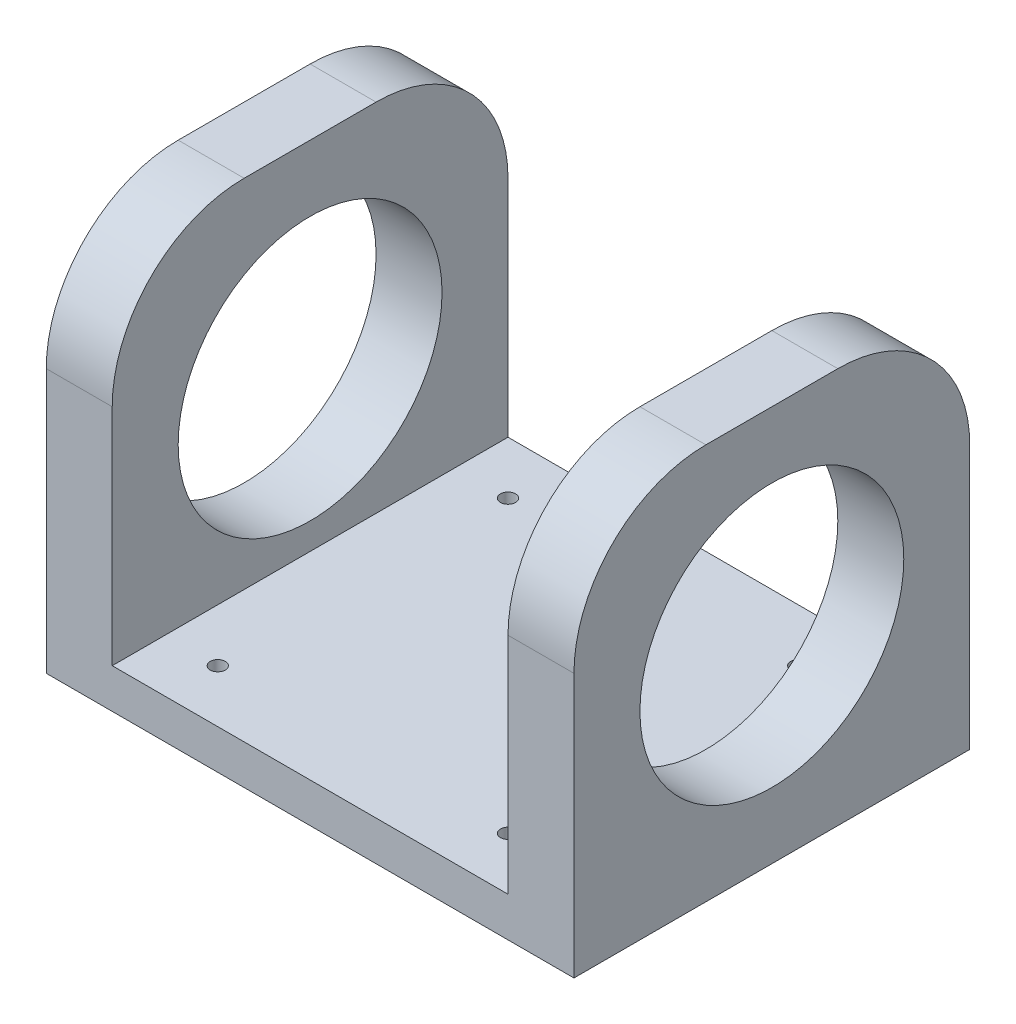
ISO-10303-21;
HEADER;
FILE_DESCRIPTION(('STEP AP214'),'2;1');
FILE_NAME('part.step','',(''),(''),'','','');
FILE_SCHEMA(('AUTOMOTIVE_DESIGN { 1 0 10303 214 1 1 1 1 }'));
ENDSEC;
DATA;
#1=APPLICATION_CONTEXT('core data for automotive mechanical design processes');
#2=APPLICATION_PROTOCOL_DEFINITION('international standard','automotive_design',2000,#1);
#3=PRODUCT_CONTEXT('',#1,'mechanical');
#4=PRODUCT('Part','Part','',(#3));
#5=PRODUCT_RELATED_PRODUCT_CATEGORY('part','',(#4));
#6=PRODUCT_DEFINITION_FORMATION('','',#4);
#7=PRODUCT_DEFINITION_CONTEXT('part definition',#1,'design');
#8=PRODUCT_DEFINITION('design','',#6,#7);
#9=PRODUCT_DEFINITION_SHAPE('','',#8);
#10=(LENGTH_UNIT() NAMED_UNIT(*) SI_UNIT(.MILLI.,.METRE.));
#11=(NAMED_UNIT(*) PLANE_ANGLE_UNIT() SI_UNIT($,.RADIAN.));
#12=(NAMED_UNIT(*) SI_UNIT($,.STERADIAN.) SOLID_ANGLE_UNIT());
#13=UNCERTAINTY_MEASURE_WITH_UNIT(LENGTH_MEASURE(1.E-05),#10,'distance_accuracy_value','');
#14=(GEOMETRIC_REPRESENTATION_CONTEXT(3) GLOBAL_UNCERTAINTY_ASSIGNED_CONTEXT((#13)) GLOBAL_UNIT_ASSIGNED_CONTEXT((#10,
#11,#12)) REPRESENTATION_CONTEXT('',''));
#15=CARTESIAN_POINT('',(0.,0.,0.));
#16=DIRECTION('',(0.,0.,1.));
#17=DIRECTION('',(1.,0.,0.));
#18=AXIS2_PLACEMENT_3D('',#15,#16,#17);
#19=CARTESIAN_POINT('',(-50.8,-30.48,-38.1));
#20=DIRECTION('',(-1.,0.,0.));
#21=DIRECTION('',(0.,0.,1.));
#22=AXIS2_PLACEMENT_3D('',#19,#20,#21);
#23=PLANE('',#22);
#24=CARTESIAN_POINT('',(-50.8,7.62000000000001,0.));
#25=DIRECTION('',(-1.,0.,0.));
#26=DIRECTION('',(0.,0.,1.));
#27=AXIS2_PLACEMENT_3D('',#24,#25,#26);
#28=CIRCLE('',#27,25.4);
#29=CARTESIAN_POINT('',(-50.8,7.62000000000001,25.4));
#30=VERTEX_POINT('',#29);
#31=EDGE_CURVE('E183',#30,#30,#28,.T.);
#32=ORIENTED_EDGE('',*,*,#31,.F.);
#33=EDGE_LOOP('',(#32));
#34=FACE_BOUND('',#33,.T.);
#35=CARTESIAN_POINT('',(-50.8,20.32,-12.7));
#36=DIRECTION('',(-1.,0.,0.));
#37=DIRECTION('',(0.,0.,-1.));
#38=AXIS2_PLACEMENT_3D('',#35,#36,#37);
#39=CIRCLE('',#38,25.4);
#40=CARTESIAN_POINT('',(-50.8,45.72,-12.7));
#41=VERTEX_POINT('',#40);
#42=CARTESIAN_POINT('',(-50.8,20.32,-38.1));
#43=VERTEX_POINT('',#42);
#44=EDGE_CURVE('E197',#41,#43,#39,.T.);
#45=ORIENTED_EDGE('',*,*,#44,.T.);
#46=DIRECTION('',(0.,1.,0.));
#47=VECTOR('',#46,1.);
#48=CARTESIAN_POINT('',(-50.8,-30.48,-38.1));
#49=LINE('',#48,#47);
#50=CARTESIAN_POINT('',(-50.8,-30.48,-38.1));
#51=VERTEX_POINT('',#50);
#52=EDGE_CURVE('E11',#51,#43,#49,.T.);
#53=ORIENTED_EDGE('',*,*,#52,.F.);
#54=DIRECTION('',(0.,0.,1.));
#55=VECTOR('',#54,1.);
#56=CARTESIAN_POINT('',(-50.8,-30.48,-38.1));
#57=LINE('',#56,#55);
#58=CARTESIAN_POINT('',(-50.8,-30.48,38.1));
#59=VERTEX_POINT('',#58);
#60=EDGE_CURVE('E217',#51,#59,#57,.T.);
#61=ORIENTED_EDGE('',*,*,#60,.T.);
#62=DIRECTION('',(0.,1.,0.));
#63=VECTOR('',#62,1.);
#64=CARTESIAN_POINT('',(-50.8,-30.48,38.1));
#65=LINE('',#64,#63);
#66=CARTESIAN_POINT('',(-50.8,20.32,38.1));
#67=VERTEX_POINT('',#66);
#68=EDGE_CURVE('E39',#59,#67,#65,.T.);
#69=ORIENTED_EDGE('',*,*,#68,.T.);
#70=CARTESIAN_POINT('',(-50.8,20.32,12.7));
#71=DIRECTION('',(-1.,0.,0.));
#72=DIRECTION('',(0.,0.,-1.));
#73=AXIS2_PLACEMENT_3D('',#70,#71,#72);
#74=CIRCLE('',#73,25.4);
#75=CARTESIAN_POINT('',(-50.8,45.72,12.7));
#76=VERTEX_POINT('',#75);
#77=EDGE_CURVE('E194',#67,#76,#74,.T.);
#78=ORIENTED_EDGE('',*,*,#77,.T.);
#79=DIRECTION('',(0.,0.,-1.));
#80=VECTOR('',#79,1.);
#81=CARTESIAN_POINT('',(-50.8,45.72,-12.7));
#82=LINE('',#81,#80);
#83=EDGE_CURVE('E209',#76,#41,#82,.T.);
#84=ORIENTED_EDGE('',*,*,#83,.T.);
#85=EDGE_LOOP('',(#45,#53,#61,#69,#78,#84));
#86=FACE_BOUND('',#85,.T.);
#87=ADVANCED_FACE('F36',(#34,#86),#23,.T.);
#88=CARTESIAN_POINT('',(50.8,-30.48,-38.1));
#89=DIRECTION('',(0.,0.,-1.));
#90=DIRECTION('',(-1.,0.,0.));
#91=AXIS2_PLACEMENT_3D('',#88,#89,#90);
#92=PLANE('',#91);
#93=DIRECTION('',(0.,-1.,0.));
#94=VECTOR('',#93,1.);
#95=CARTESIAN_POINT('',(-38.1,-30.48,-38.1));
#96=LINE('',#95,#94);
#97=CARTESIAN_POINT('',(-38.1,20.32,-38.1));
#98=VERTEX_POINT('',#97);
#99=CARTESIAN_POINT('',(-38.1,-22.86,-38.1));
#100=VERTEX_POINT('',#99);
#101=EDGE_CURVE('E136',#98,#100,#96,.T.);
#102=ORIENTED_EDGE('',*,*,#101,.T.);
#103=DIRECTION('',(-1.,0.,0.));
#104=VECTOR('',#103,1.);
#105=CARTESIAN_POINT('',(-38.1,-22.86,-38.1));
#106=LINE('',#105,#104);
#107=CARTESIAN_POINT('',(38.1,-22.86,-38.1));
#108=VERTEX_POINT('',#107);
#109=EDGE_CURVE('E144',#108,#100,#106,.T.);
#110=ORIENTED_EDGE('',*,*,#109,.F.);
#111=DIRECTION('',(0.,-1.,0.));
#112=VECTOR('',#111,1.);
#113=CARTESIAN_POINT('',(38.1,-30.48,-38.1));
#114=LINE('',#113,#112);
#115=CARTESIAN_POINT('',(38.1,20.32,-38.1));
#116=VERTEX_POINT('',#115);
#117=EDGE_CURVE('E164',#116,#108,#114,.T.);
#118=ORIENTED_EDGE('',*,*,#117,.F.);
#119=DIRECTION('',(1.,0.,0.));
#120=VECTOR('',#119,1.);
#121=CARTESIAN_POINT('',(38.1,20.32,-38.1));
#122=LINE('',#121,#120);
#123=CARTESIAN_POINT('',(50.8,20.32,-38.1));
#124=VERTEX_POINT('',#123);
#125=EDGE_CURVE('E174',#116,#124,#122,.T.);
#126=ORIENTED_EDGE('',*,*,#125,.T.);
#127=DIRECTION('',(0.,1.,0.));
#128=VECTOR('',#127,1.);
#129=CARTESIAN_POINT('',(50.8,-30.48,-38.1));
#130=LINE('',#129,#128);
#131=CARTESIAN_POINT('',(50.8,-30.48,-38.1));
#132=VERTEX_POINT('',#131);
#133=EDGE_CURVE('E44',#132,#124,#130,.T.);
#134=ORIENTED_EDGE('',*,*,#133,.F.);
#135=DIRECTION('',(-1.,0.,0.));
#136=VECTOR('',#135,1.);
#137=CARTESIAN_POINT('',(50.8,-30.48,-38.1));
#138=LINE('',#137,#136);
#139=EDGE_CURVE('E51',#132,#51,#138,.T.);
#140=ORIENTED_EDGE('',*,*,#139,.T.);
#141=ORIENTED_EDGE('',*,*,#52,.T.);
#142=DIRECTION('',(-1.,0.,0.));
#143=VECTOR('',#142,1.);
#144=CARTESIAN_POINT('',(-38.1,20.32,-38.1));
#145=LINE('',#144,#143);
#146=EDGE_CURVE('E214',#98,#43,#145,.T.);
#147=ORIENTED_EDGE('',*,*,#146,.F.);
#148=EDGE_LOOP('',(#102,#110,#118,#126,#134,#140,#141,#147));
#149=FACE_BOUND('',#148,.T.);
#150=ADVANCED_FACE('F245',(#149),#92,.T.);
#151=CARTESIAN_POINT('',(50.8,-30.48,-38.1));
#152=DIRECTION('',(1.,0.,0.));
#153=DIRECTION('',(0.,0.,-1.));
#154=AXIS2_PLACEMENT_3D('',#151,#152,#153);
#155=PLANE('',#154);
#156=CARTESIAN_POINT('',(50.8,7.62000000000001,0.));
#157=DIRECTION('',(-1.,0.,0.));
#158=DIRECTION('',(0.,0.,1.));
#159=AXIS2_PLACEMENT_3D('',#156,#157,#158);
#160=CIRCLE('',#159,25.4);
#161=CARTESIAN_POINT('',(50.8,7.62000000000001,25.4));
#162=VERTEX_POINT('',#161);
#163=EDGE_CURVE('E157',#162,#162,#160,.T.);
#164=ORIENTED_EDGE('',*,*,#163,.T.);
#165=EDGE_LOOP('',(#164));
#166=FACE_BOUND('',#165,.T.);
#167=ORIENTED_EDGE('',*,*,#133,.T.);
#168=CARTESIAN_POINT('',(50.8,20.32,-12.7));
#169=DIRECTION('',(-1.,0.,0.));
#170=DIRECTION('',(0.,0.,-1.));
#171=AXIS2_PLACEMENT_3D('',#168,#169,#170);
#172=CIRCLE('',#171,25.4);
#173=CARTESIAN_POINT('',(50.8,45.72,-12.7));
#174=VERTEX_POINT('',#173);
#175=EDGE_CURVE('E161',#174,#124,#172,.T.);
#176=ORIENTED_EDGE('',*,*,#175,.F.);
#177=DIRECTION('',(0.,0.,-1.));
#178=VECTOR('',#177,1.);
#179=CARTESIAN_POINT('',(50.8,45.72,-12.7));
#180=LINE('',#179,#178);
#181=CARTESIAN_POINT('',(50.8,45.72,12.7));
#182=VERTEX_POINT('',#181);
#183=EDGE_CURVE('E177',#182,#174,#180,.T.);
#184=ORIENTED_EDGE('',*,*,#183,.F.);
#185=CARTESIAN_POINT('',(50.8,20.32,12.7));
#186=DIRECTION('',(-1.,0.,0.));
#187=DIRECTION('',(0.,0.,-1.));
#188=AXIS2_PLACEMENT_3D('',#185,#186,#187);
#189=CIRCLE('',#188,25.4);
#190=CARTESIAN_POINT('',(50.8,20.32,38.1));
#191=VERTEX_POINT('',#190);
#192=EDGE_CURVE('E167',#191,#182,#189,.T.);
#193=ORIENTED_EDGE('',*,*,#192,.F.);
#194=DIRECTION('',(0.,1.,0.));
#195=VECTOR('',#194,1.);
#196=CARTESIAN_POINT('',(50.8,-30.48,38.1));
#197=LINE('',#196,#195);
#198=CARTESIAN_POINT('',(50.8,-30.48,38.1));
#199=VERTEX_POINT('',#198);
#200=EDGE_CURVE('E230',#199,#191,#197,.T.);
#201=ORIENTED_EDGE('',*,*,#200,.F.);
#202=DIRECTION('',(0.,0.,-1.));
#203=VECTOR('',#202,1.);
#204=CARTESIAN_POINT('',(50.8,-30.48,-38.1));
#205=LINE('',#204,#203);
#206=EDGE_CURVE('E227',#199,#132,#205,.T.);
#207=ORIENTED_EDGE('',*,*,#206,.T.);
#208=EDGE_LOOP('',(#167,#176,#184,#193,#201,#207));
#209=FACE_BOUND('',#208,.T.);
#210=ADVANCED_FACE('F251',(#166,#209),#155,.T.);
#211=CARTESIAN_POINT('',(50.8,-30.48,38.1));
#212=DIRECTION('',(0.,0.,1.));
#213=DIRECTION('',(1.,0.,0.));
#214=AXIS2_PLACEMENT_3D('',#211,#212,#213);
#215=PLANE('',#214);
#216=DIRECTION('',(1.,0.,0.));
#217=VECTOR('',#216,1.);
#218=CARTESIAN_POINT('',(-38.1,-22.86,38.1));
#219=LINE('',#218,#217);
#220=CARTESIAN_POINT('',(-38.1,-22.86,38.1));
#221=VERTEX_POINT('',#220);
#222=CARTESIAN_POINT('',(38.1,-22.86,38.1));
#223=VERTEX_POINT('',#222);
#224=EDGE_CURVE('E142',#221,#223,#219,.T.);
#225=ORIENTED_EDGE('',*,*,#224,.F.);
#226=DIRECTION('',(0.,1.,0.));
#227=VECTOR('',#226,1.);
#228=CARTESIAN_POINT('',(-38.1,-30.48,38.1));
#229=LINE('',#228,#227);
#230=CARTESIAN_POINT('',(-38.1,20.32,38.1));
#231=VERTEX_POINT('',#230);
#232=EDGE_CURVE('E123',#221,#231,#229,.T.);
#233=ORIENTED_EDGE('',*,*,#232,.T.);
#234=DIRECTION('',(-1.,0.,0.));
#235=VECTOR('',#234,1.);
#236=CARTESIAN_POINT('',(-38.1,20.32,38.1));
#237=LINE('',#236,#235);
#238=EDGE_CURVE('E206',#231,#67,#237,.T.);
#239=ORIENTED_EDGE('',*,*,#238,.T.);
#240=ORIENTED_EDGE('',*,*,#68,.F.);
#241=DIRECTION('',(1.,0.,0.));
#242=VECTOR('',#241,1.);
#243=CARTESIAN_POINT('',(50.8,-30.48,38.1));
#244=LINE('',#243,#242);
#245=EDGE_CURVE('E225',#59,#199,#244,.T.);
#246=ORIENTED_EDGE('',*,*,#245,.T.);
#247=ORIENTED_EDGE('',*,*,#200,.T.);
#248=DIRECTION('',(1.,0.,0.));
#249=VECTOR('',#248,1.);
#250=CARTESIAN_POINT('',(38.1,20.32,38.1));
#251=LINE('',#250,#249);
#252=CARTESIAN_POINT('',(38.1,20.32,38.1));
#253=VERTEX_POINT('',#252);
#254=EDGE_CURVE('E180',#253,#191,#251,.T.);
#255=ORIENTED_EDGE('',*,*,#254,.F.);
#256=DIRECTION('',(0.,1.,0.));
#257=VECTOR('',#256,1.);
#258=CARTESIAN_POINT('',(38.1,-30.48,38.1));
#259=LINE('',#258,#257);
#260=EDGE_CURVE('E149',#223,#253,#259,.T.);
#261=ORIENTED_EDGE('',*,*,#260,.F.);
#262=EDGE_LOOP('',(#225,#233,#239,#240,#246,#247,#255,#261));
#263=FACE_BOUND('',#262,.T.);
#264=ADVANCED_FACE('F147',(#263),#215,.T.);
#265=CARTESIAN_POINT('',(0.,-30.48,0.));
#266=DIRECTION('',(0.,-1.,0.));
#267=DIRECTION('',(0.,0.,-1.));
#268=AXIS2_PLACEMENT_3D('',#265,#266,#267);
#269=PLANE('',#268);
#270=CARTESIAN_POINT('',(-27.94,-30.48,27.94));
#271=DIRECTION('',(0.,-1.,0.));
#272=DIRECTION('',(0.,0.,-1.));
#273=AXIS2_PLACEMENT_3D('',#270,#271,#272);
#274=CIRCLE('',#273,1.45);
#275=CARTESIAN_POINT('',(-27.94,-30.48,26.49));
#276=VERTEX_POINT('',#275);
#277=EDGE_CURVE('E145',#276,#276,#274,.T.);
#278=ORIENTED_EDGE('',*,*,#277,.F.);
#279=EDGE_LOOP('',(#278));
#280=FACE_BOUND('',#279,.T.);
#281=CARTESIAN_POINT('',(27.94,-30.48,27.94));
#282=DIRECTION('',(0.,-1.,0.));
#283=DIRECTION('',(0.,0.,-1.));
#284=AXIS2_PLACEMENT_3D('',#281,#282,#283);
#285=CIRCLE('',#284,1.45);
#286=CARTESIAN_POINT('',(27.94,-30.48,26.49));
#287=VERTEX_POINT('',#286);
#288=EDGE_CURVE('E503',#287,#287,#285,.T.);
#289=ORIENTED_EDGE('',*,*,#288,.F.);
#290=EDGE_LOOP('',(#289));
#291=FACE_BOUND('',#290,.T.);
#292=CARTESIAN_POINT('',(27.94,-30.48,-27.94));
#293=DIRECTION('',(0.,-1.,0.));
#294=DIRECTION('',(0.,0.,-1.));
#295=AXIS2_PLACEMENT_3D('',#292,#293,#294);
#296=CIRCLE('',#295,1.45);
#297=CARTESIAN_POINT('',(27.94,-30.48,-29.39));
#298=VERTEX_POINT('',#297);
#299=EDGE_CURVE('E500',#298,#298,#296,.T.);
#300=ORIENTED_EDGE('',*,*,#299,.F.);
#301=EDGE_LOOP('',(#300));
#302=FACE_BOUND('',#301,.T.);
#303=CARTESIAN_POINT('',(-27.94,-30.48,-27.94));
#304=DIRECTION('',(0.,-1.,0.));
#305=DIRECTION('',(0.,0.,-1.));
#306=AXIS2_PLACEMENT_3D('',#303,#304,#305);
#307=CIRCLE('',#306,1.45);
#308=CARTESIAN_POINT('',(-27.94,-30.48,-29.39));
#309=VERTEX_POINT('',#308);
#310=EDGE_CURVE('E497',#309,#309,#307,.T.);
#311=ORIENTED_EDGE('',*,*,#310,.F.);
#312=EDGE_LOOP('',(#311));
#313=FACE_BOUND('',#312,.T.);
#314=ORIENTED_EDGE('',*,*,#60,.F.);
#315=ORIENTED_EDGE('',*,*,#139,.F.);
#316=ORIENTED_EDGE('',*,*,#206,.F.);
#317=ORIENTED_EDGE('',*,*,#245,.F.);
#318=EDGE_LOOP('',(#314,#315,#316,#317));
#319=FACE_BOUND('',#318,.T.);
#320=ADVANCED_FACE('F247',(#280,#291,#302,#313,#319),#269,.T.);
#321=CARTESIAN_POINT('',(-38.1,20.32,-12.7));
#322=DIRECTION('',(1.,0.,0.));
#323=DIRECTION('',(0.,0.,-1.));
#324=AXIS2_PLACEMENT_3D('',#321,#322,#323);
#325=PLANE('',#324);
#326=CARTESIAN_POINT('',(-38.1,7.62000000000001,0.));
#327=DIRECTION('',(-1.,0.,0.));
#328=DIRECTION('',(0.,0.,1.));
#329=AXIS2_PLACEMENT_3D('',#326,#327,#328);
#330=CIRCLE('',#329,25.4);
#331=CARTESIAN_POINT('',(-38.1,7.62000000000001,25.4));
#332=VERTEX_POINT('',#331);
#333=EDGE_CURVE('E191',#332,#332,#330,.T.);
#334=ORIENTED_EDGE('',*,*,#333,.T.);
#335=EDGE_LOOP('',(#334));
#336=FACE_BOUND('',#335,.T.);
#337=DIRECTION('',(0.,0.,1.));
#338=VECTOR('',#337,1.);
#339=CARTESIAN_POINT('',(-38.1,-22.86,-38.1));
#340=LINE('',#339,#338);
#341=EDGE_CURVE('E127',#100,#221,#340,.T.);
#342=ORIENTED_EDGE('',*,*,#341,.F.);
#343=ORIENTED_EDGE('',*,*,#101,.F.);
#344=CARTESIAN_POINT('',(-38.1,20.32,-12.7));
#345=DIRECTION('',(-1.,0.,0.));
#346=DIRECTION('',(0.,0.,-1.));
#347=AXIS2_PLACEMENT_3D('',#344,#345,#346);
#348=CIRCLE('',#347,25.4);
#349=CARTESIAN_POINT('',(-38.1,45.72,-12.7));
#350=VERTEX_POINT('',#349);
#351=EDGE_CURVE('E203',#350,#98,#348,.T.);
#352=ORIENTED_EDGE('',*,*,#351,.F.);
#353=DIRECTION('',(0.,0.,-1.));
#354=VECTOR('',#353,1.);
#355=CARTESIAN_POINT('',(-38.1,45.72,-12.7));
#356=LINE('',#355,#354);
#357=CARTESIAN_POINT('',(-38.1,45.72,12.7));
#358=VERTEX_POINT('',#357);
#359=EDGE_CURVE('E200',#358,#350,#356,.T.);
#360=ORIENTED_EDGE('',*,*,#359,.F.);
#361=CARTESIAN_POINT('',(-38.1,20.32,12.7));
#362=DIRECTION('',(-1.,0.,0.));
#363=DIRECTION('',(0.,0.,-1.));
#364=AXIS2_PLACEMENT_3D('',#361,#362,#363);
#365=CIRCLE('',#364,25.4);
#366=EDGE_CURVE('E131',#231,#358,#365,.T.);
#367=ORIENTED_EDGE('',*,*,#366,.F.);
#368=ORIENTED_EDGE('',*,*,#232,.F.);
#369=EDGE_LOOP('',(#342,#343,#352,#360,#367,#368));
#370=FACE_BOUND('',#369,.T.);
#371=ADVANCED_FACE('F125',(#336,#370),#325,.T.);
#372=CARTESIAN_POINT('',(-38.1,7.62000000000001,0.));
#373=DIRECTION('',(-1.,0.,0.));
#374=DIRECTION('',(0.,0.,1.));
#375=AXIS2_PLACEMENT_3D('',#372,#373,#374);
#376=CYLINDRICAL_SURFACE('',#375,25.4);
#377=ORIENTED_EDGE('',*,*,#31,.T.);
#378=EDGE_LOOP('',(#377));
#379=FACE_BOUND('',#378,.T.);
#380=ORIENTED_EDGE('',*,*,#333,.F.);
#381=EDGE_LOOP('',(#380));
#382=FACE_BOUND('',#381,.T.);
#383=ADVANCED_FACE('F288',(#379,#382),#376,.F.);
#384=CARTESIAN_POINT('',(-38.1,20.32,-12.7));
#385=DIRECTION('',(-1.,0.,0.));
#386=DIRECTION('',(0.,0.,1.));
#387=AXIS2_PLACEMENT_3D('',#384,#385,#386);
#388=CYLINDRICAL_SURFACE('',#387,25.4);
#389=ORIENTED_EDGE('',*,*,#44,.F.);
#390=DIRECTION('',(-1.,0.,0.));
#391=VECTOR('',#390,1.);
#392=CARTESIAN_POINT('',(-38.1,45.72,-12.7));
#393=LINE('',#392,#391);
#394=EDGE_CURVE('E218',#350,#41,#393,.T.);
#395=ORIENTED_EDGE('',*,*,#394,.F.);
#396=ORIENTED_EDGE('',*,*,#351,.T.);
#397=ORIENTED_EDGE('',*,*,#146,.T.);
#398=EDGE_LOOP('',(#389,#395,#396,#397));
#399=FACE_BOUND('',#398,.T.);
#400=ADVANCED_FACE('F243',(#399),#388,.T.);
#401=CARTESIAN_POINT('',(-38.1,45.72,-12.7));
#402=DIRECTION('',(0.,1.,0.));
#403=DIRECTION('',(0.,0.,1.));
#404=AXIS2_PLACEMENT_3D('',#401,#402,#403);
#405=PLANE('',#404);
#406=ORIENTED_EDGE('',*,*,#83,.F.);
#407=DIRECTION('',(-1.,0.,0.));
#408=VECTOR('',#407,1.);
#409=CARTESIAN_POINT('',(-38.1,45.72,12.7));
#410=LINE('',#409,#408);
#411=EDGE_CURVE('E220',#358,#76,#410,.T.);
#412=ORIENTED_EDGE('',*,*,#411,.F.);
#413=ORIENTED_EDGE('',*,*,#359,.T.);
#414=ORIENTED_EDGE('',*,*,#394,.T.);
#415=EDGE_LOOP('',(#406,#412,#413,#414));
#416=FACE_BOUND('',#415,.T.);
#417=ADVANCED_FACE('F240',(#416),#405,.T.);
#418=CARTESIAN_POINT('',(-38.1,20.32,12.7));
#419=DIRECTION('',(-1.,0.,0.));
#420=DIRECTION('',(0.,0.,1.));
#421=AXIS2_PLACEMENT_3D('',#418,#419,#420);
#422=CYLINDRICAL_SURFACE('',#421,25.4);
#423=ORIENTED_EDGE('',*,*,#77,.F.);
#424=ORIENTED_EDGE('',*,*,#238,.F.);
#425=ORIENTED_EDGE('',*,*,#366,.T.);
#426=ORIENTED_EDGE('',*,*,#411,.T.);
#427=EDGE_LOOP('',(#423,#424,#425,#426));
#428=FACE_BOUND('',#427,.T.);
#429=ADVANCED_FACE('F237',(#428),#422,.T.);
#430=CARTESIAN_POINT('',(38.1,20.32,-12.7));
#431=DIRECTION('',(-1.,0.,0.));
#432=DIRECTION('',(0.,0.,-1.));
#433=AXIS2_PLACEMENT_3D('',#430,#431,#432);
#434=PLANE('',#433);
#435=CARTESIAN_POINT('',(38.1,7.62000000000001,0.));
#436=DIRECTION('',(-1.,0.,0.));
#437=DIRECTION('',(0.,0.,1.));
#438=AXIS2_PLACEMENT_3D('',#435,#436,#437);
#439=CIRCLE('',#438,25.4);
#440=CARTESIAN_POINT('',(38.1,7.62000000000001,25.4));
#441=VERTEX_POINT('',#440);
#442=EDGE_CURVE('E158',#441,#441,#439,.T.);
#443=ORIENTED_EDGE('',*,*,#442,.F.);
#444=EDGE_LOOP('',(#443));
#445=FACE_BOUND('',#444,.T.);
#446=DIRECTION('',(0.,0.,-1.));
#447=VECTOR('',#446,1.);
#448=CARTESIAN_POINT('',(38.1,-22.86,-38.1));
#449=LINE('',#448,#447);
#450=EDGE_CURVE('E151',#223,#108,#449,.T.);
#451=ORIENTED_EDGE('',*,*,#450,.F.);
#452=ORIENTED_EDGE('',*,*,#260,.T.);
#453=CARTESIAN_POINT('',(38.1,20.32,12.7));
#454=DIRECTION('',(-1.,0.,0.));
#455=DIRECTION('',(0.,0.,-1.));
#456=AXIS2_PLACEMENT_3D('',#453,#454,#455);
#457=CIRCLE('',#456,25.4);
#458=CARTESIAN_POINT('',(38.1,45.72,12.7));
#459=VERTEX_POINT('',#458);
#460=EDGE_CURVE('E171',#253,#459,#457,.T.);
#461=ORIENTED_EDGE('',*,*,#460,.T.);
#462=DIRECTION('',(0.,0.,-1.));
#463=VECTOR('',#462,1.);
#464=CARTESIAN_POINT('',(38.1,45.72,-12.7));
#465=LINE('',#464,#463);
#466=CARTESIAN_POINT('',(38.1,45.72,-12.7));
#467=VERTEX_POINT('',#466);
#468=EDGE_CURVE('E169',#459,#467,#465,.T.);
#469=ORIENTED_EDGE('',*,*,#468,.T.);
#470=CARTESIAN_POINT('',(38.1,20.32,-12.7));
#471=DIRECTION('',(-1.,0.,0.));
#472=DIRECTION('',(0.,0.,-1.));
#473=AXIS2_PLACEMENT_3D('',#470,#471,#472);
#474=CIRCLE('',#473,25.4);
#475=EDGE_CURVE('E166',#467,#116,#474,.T.);
#476=ORIENTED_EDGE('',*,*,#475,.T.);
#477=ORIENTED_EDGE('',*,*,#117,.T.);
#478=EDGE_LOOP('',(#451,#452,#461,#469,#476,#477));
#479=FACE_BOUND('',#478,.T.);
#480=ADVANCED_FACE('F264',(#445,#479),#434,.T.);
#481=CARTESIAN_POINT('',(38.1,7.62000000000001,0.));
#482=DIRECTION('',(1.,0.,0.));
#483=DIRECTION('',(0.,0.,-1.));
#484=AXIS2_PLACEMENT_3D('',#481,#482,#483);
#485=CYLINDRICAL_SURFACE('',#484,25.4);
#486=ORIENTED_EDGE('',*,*,#163,.F.);
#487=EDGE_LOOP('',(#486));
#488=FACE_BOUND('',#487,.T.);
#489=ORIENTED_EDGE('',*,*,#442,.T.);
#490=EDGE_LOOP('',(#489));
#491=FACE_BOUND('',#490,.T.);
#492=ADVANCED_FACE('F327',(#488,#491),#485,.F.);
#493=CARTESIAN_POINT('',(38.1,20.32,12.7));
#494=DIRECTION('',(1.,0.,0.));
#495=DIRECTION('',(0.,0.,-1.));
#496=AXIS2_PLACEMENT_3D('',#493,#494,#495);
#497=CYLINDRICAL_SURFACE('',#496,25.4);
#498=ORIENTED_EDGE('',*,*,#192,.T.);
#499=DIRECTION('',(1.,0.,0.));
#500=VECTOR('',#499,1.);
#501=CARTESIAN_POINT('',(38.1,45.72,12.7));
#502=LINE('',#501,#500);
#503=EDGE_CURVE('E184',#459,#182,#502,.T.);
#504=ORIENTED_EDGE('',*,*,#503,.F.);
#505=ORIENTED_EDGE('',*,*,#460,.F.);
#506=ORIENTED_EDGE('',*,*,#254,.T.);
#507=EDGE_LOOP('',(#498,#504,#505,#506));
#508=FACE_BOUND('',#507,.T.);
#509=ADVANCED_FACE('F256',(#508),#497,.T.);
#510=CARTESIAN_POINT('',(38.1,45.72,-12.7));
#511=DIRECTION('',(0.,-1.,0.));
#512=DIRECTION('',(0.,0.,-1.));
#513=AXIS2_PLACEMENT_3D('',#510,#511,#512);
#514=PLANE('',#513);
#515=ORIENTED_EDGE('',*,*,#183,.T.);
#516=DIRECTION('',(1.,0.,0.));
#517=VECTOR('',#516,1.);
#518=CARTESIAN_POINT('',(38.1,45.72,-12.7));
#519=LINE('',#518,#517);
#520=EDGE_CURVE('E187',#467,#174,#519,.T.);
#521=ORIENTED_EDGE('',*,*,#520,.F.);
#522=ORIENTED_EDGE('',*,*,#468,.F.);
#523=ORIENTED_EDGE('',*,*,#503,.T.);
#524=EDGE_LOOP('',(#515,#521,#522,#523));
#525=FACE_BOUND('',#524,.T.);
#526=ADVANCED_FACE('F260',(#525),#514,.F.);
#527=CARTESIAN_POINT('',(38.1,20.32,-12.7));
#528=DIRECTION('',(1.,0.,0.));
#529=DIRECTION('',(0.,0.,-1.));
#530=AXIS2_PLACEMENT_3D('',#527,#528,#529);
#531=CYLINDRICAL_SURFACE('',#530,25.4);
#532=ORIENTED_EDGE('',*,*,#175,.T.);
#533=ORIENTED_EDGE('',*,*,#125,.F.);
#534=ORIENTED_EDGE('',*,*,#475,.F.);
#535=ORIENTED_EDGE('',*,*,#520,.T.);
#536=EDGE_LOOP('',(#532,#533,#534,#535));
#537=FACE_BOUND('',#536,.T.);
#538=ADVANCED_FACE('F268',(#537),#531,.T.);
#539=CARTESIAN_POINT('',(0.,-22.86,0.));
#540=DIRECTION('',(0.,1.,0.));
#541=DIRECTION('',(0.,0.,1.));
#542=AXIS2_PLACEMENT_3D('',#539,#540,#541);
#543=PLANE('',#542);
#544=CARTESIAN_POINT('',(-27.94,-22.86,27.94));
#545=DIRECTION('',(0.,1.,0.));
#546=DIRECTION('',(0.,0.,-1.));
#547=AXIS2_PLACEMENT_3D('',#544,#545,#546);
#548=CIRCLE('',#547,1.45);
#549=CARTESIAN_POINT('',(-27.94,-22.86,26.49));
#550=VERTEX_POINT('',#549);
#551=EDGE_CURVE('E486',#550,#550,#548,.T.);
#552=ORIENTED_EDGE('',*,*,#551,.F.);
#553=EDGE_LOOP('',(#552));
#554=FACE_BOUND('',#553,.T.);
#555=CARTESIAN_POINT('',(27.94,-22.86,27.94));
#556=DIRECTION('',(0.,1.,0.));
#557=DIRECTION('',(0.,0.,1.));
#558=AXIS2_PLACEMENT_3D('',#555,#556,#557);
#559=CIRCLE('',#558,1.45);
#560=CARTESIAN_POINT('',(27.94,-22.86,29.39));
#561=VERTEX_POINT('',#560);
#562=EDGE_CURVE('E487',#561,#561,#559,.T.);
#563=ORIENTED_EDGE('',*,*,#562,.F.);
#564=EDGE_LOOP('',(#563));
#565=FACE_BOUND('',#564,.T.);
#566=CARTESIAN_POINT('',(27.94,-22.86,-27.94));
#567=DIRECTION('',(0.,1.,0.));
#568=DIRECTION('',(0.,0.,-1.));
#569=AXIS2_PLACEMENT_3D('',#566,#567,#568);
#570=CIRCLE('',#569,1.45);
#571=CARTESIAN_POINT('',(27.94,-22.86,-29.39));
#572=VERTEX_POINT('',#571);
#573=EDGE_CURVE('E490',#572,#572,#570,.T.);
#574=ORIENTED_EDGE('',*,*,#573,.F.);
#575=EDGE_LOOP('',(#574));
#576=FACE_BOUND('',#575,.T.);
#577=CARTESIAN_POINT('',(-27.94,-22.86,-27.94));
#578=DIRECTION('',(0.,1.,0.));
#579=DIRECTION('',(0.,0.,1.));
#580=AXIS2_PLACEMENT_3D('',#577,#578,#579);
#581=CIRCLE('',#580,1.45);
#582=CARTESIAN_POINT('',(-27.94,-22.86,-26.49));
#583=VERTEX_POINT('',#582);
#584=EDGE_CURVE('E494',#583,#583,#581,.T.);
#585=ORIENTED_EDGE('',*,*,#584,.F.);
#586=EDGE_LOOP('',(#585));
#587=FACE_BOUND('',#586,.T.);
#588=ORIENTED_EDGE('',*,*,#341,.T.);
#589=ORIENTED_EDGE('',*,*,#224,.T.);
#590=ORIENTED_EDGE('',*,*,#450,.T.);
#591=ORIENTED_EDGE('',*,*,#109,.T.);
#592=EDGE_LOOP('',(#588,#589,#590,#591));
#593=FACE_BOUND('',#592,.T.);
#594=ADVANCED_FACE('F140',(#554,#565,#576,#587,#593),#543,.T.);
#595=CARTESIAN_POINT('',(-27.94,-278.892,-27.94));
#596=DIRECTION('',(0.,1.,0.));
#597=DIRECTION('',(0.,0.,1.));
#598=AXIS2_PLACEMENT_3D('',#595,#596,#597);
#599=CYLINDRICAL_SURFACE('',#598,1.45);
#600=ORIENTED_EDGE('',*,*,#310,.T.);
#601=EDGE_LOOP('',(#600));
#602=FACE_BOUND('',#601,.T.);
#603=ORIENTED_EDGE('',*,*,#584,.T.);
#604=EDGE_LOOP('',(#603));
#605=FACE_BOUND('',#604,.T.);
#606=ADVANCED_FACE('F275',(#602,#605),#599,.F.);
#607=CARTESIAN_POINT('',(27.94,-278.892,-27.94));
#608=DIRECTION('',(0.,1.,0.));
#609=DIRECTION('',(0.,0.,1.));
#610=AXIS2_PLACEMENT_3D('',#607,#608,#609);
#611=CYLINDRICAL_SURFACE('',#610,1.45);
#612=ORIENTED_EDGE('',*,*,#299,.T.);
#613=EDGE_LOOP('',(#612));
#614=FACE_BOUND('',#613,.T.);
#615=ORIENTED_EDGE('',*,*,#573,.T.);
#616=EDGE_LOOP('',(#615));
#617=FACE_BOUND('',#616,.T.);
#618=ADVANCED_FACE('F344',(#614,#617),#611,.F.);
#619=CARTESIAN_POINT('',(27.94,-278.892,27.94));
#620=DIRECTION('',(0.,1.,0.));
#621=DIRECTION('',(0.,0.,1.));
#622=AXIS2_PLACEMENT_3D('',#619,#620,#621);
#623=CYLINDRICAL_SURFACE('',#622,1.45);
#624=ORIENTED_EDGE('',*,*,#288,.T.);
#625=EDGE_LOOP('',(#624));
#626=FACE_BOUND('',#625,.T.);
#627=ORIENTED_EDGE('',*,*,#562,.T.);
#628=EDGE_LOOP('',(#627));
#629=FACE_BOUND('',#628,.T.);
#630=ADVANCED_FACE('F354',(#626,#629),#623,.F.);
#631=CARTESIAN_POINT('',(-27.94,-278.892,27.94));
#632=DIRECTION('',(0.,1.,0.));
#633=DIRECTION('',(0.,0.,1.));
#634=AXIS2_PLACEMENT_3D('',#631,#632,#633);
#635=CYLINDRICAL_SURFACE('',#634,1.45);
#636=ORIENTED_EDGE('',*,*,#277,.T.);
#637=EDGE_LOOP('',(#636));
#638=FACE_BOUND('',#637,.T.);
#639=ORIENTED_EDGE('',*,*,#551,.T.);
#640=EDGE_LOOP('',(#639));
#641=FACE_BOUND('',#640,.T.);
#642=ADVANCED_FACE('F364',(#638,#641),#635,.F.);
#643=CLOSED_SHELL('',(#87,#150,#210,#264,#320,#371,#383,#400,#417,#429,#480,#492,#509,#526,#538,
#594,#606,#618,#630,#642));
#644=MANIFOLD_SOLID_BREP('B2',#643);
#645=ADVANCED_BREP_SHAPE_REPRESENTATION('',(#18,#644),#14);
#646=SHAPE_DEFINITION_REPRESENTATION(#9,#645);
ENDSEC;
END-ISO-10303-21;
